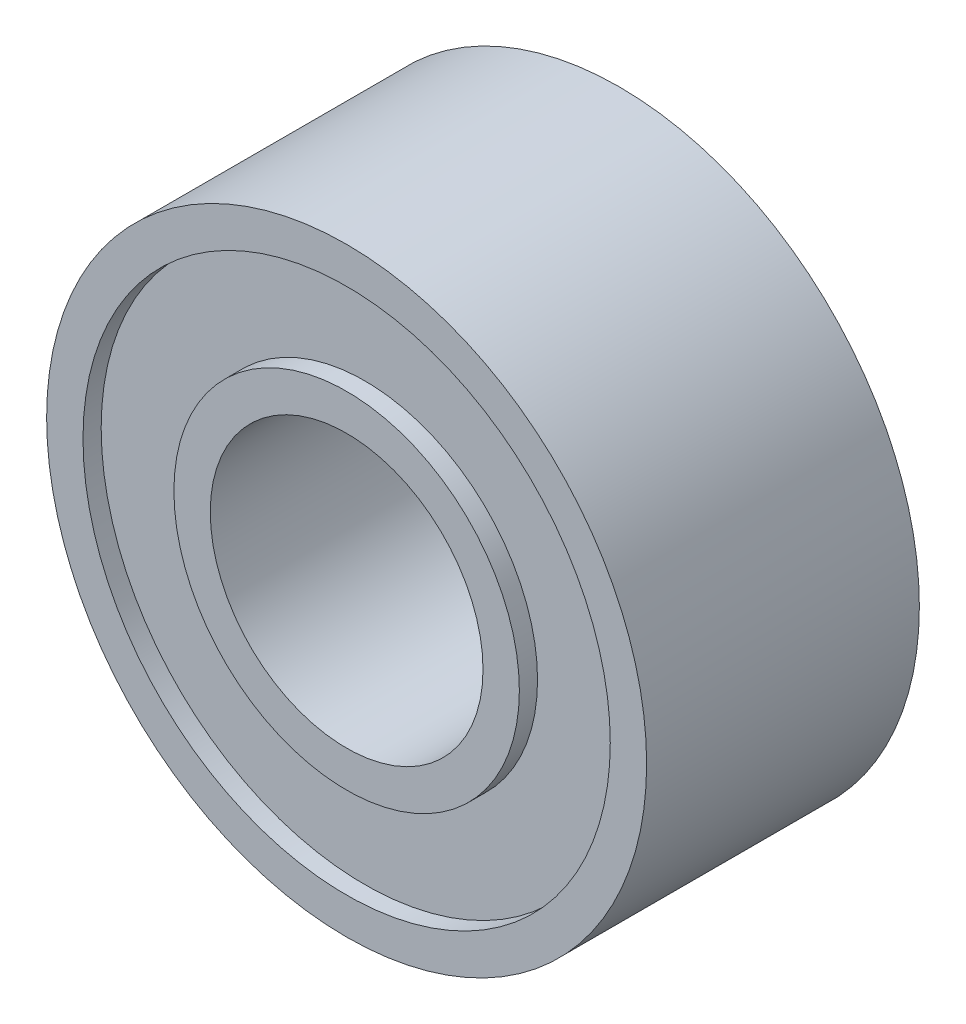
ISO-10303-21;
HEADER;
FILE_DESCRIPTION(('STEP AP214'),'2;1');
FILE_NAME('part.step','',(''),(''),'','','');
FILE_SCHEMA(('AUTOMOTIVE_DESIGN { 1 0 10303 214 1 1 1 1 }'));
ENDSEC;
DATA;
#1=APPLICATION_CONTEXT('core data for automotive mechanical design processes');
#2=APPLICATION_PROTOCOL_DEFINITION('international standard','automotive_design',2000,#1);
#3=PRODUCT_CONTEXT('',#1,'mechanical');
#4=PRODUCT('Part','Part','',(#3));
#5=PRODUCT_RELATED_PRODUCT_CATEGORY('part','',(#4));
#6=PRODUCT_DEFINITION_FORMATION('','',#4);
#7=PRODUCT_DEFINITION_CONTEXT('part definition',#1,'design');
#8=PRODUCT_DEFINITION('design','',#6,#7);
#9=PRODUCT_DEFINITION_SHAPE('','',#8);
#10=(LENGTH_UNIT() NAMED_UNIT(*) SI_UNIT(.MILLI.,.METRE.));
#11=(NAMED_UNIT(*) PLANE_ANGLE_UNIT() SI_UNIT($,.RADIAN.));
#12=(NAMED_UNIT(*) SI_UNIT($,.STERADIAN.) SOLID_ANGLE_UNIT());
#13=UNCERTAINTY_MEASURE_WITH_UNIT(LENGTH_MEASURE(1.E-05),#10,'distance_accuracy_value','');
#14=(GEOMETRIC_REPRESENTATION_CONTEXT(3) GLOBAL_UNCERTAINTY_ASSIGNED_CONTEXT((#13)) GLOBAL_UNIT_ASSIGNED_CONTEXT((#10,
#11,#12)) REPRESENTATION_CONTEXT('',''));
#15=CARTESIAN_POINT('',(0.,0.,0.));
#16=DIRECTION('',(0.,0.,1.));
#17=DIRECTION('',(1.,0.,0.));
#18=AXIS2_PLACEMENT_3D('',#15,#16,#17);
#19=CARTESIAN_POINT('',(0.,0.,7.5));
#20=DIRECTION('',(0.,0.,-1.));
#21=DIRECTION('',(-1.,0.,0.));
#22=AXIS2_PLACEMENT_3D('',#19,#20,#21);
#23=CYLINDRICAL_SURFACE('',#22,9.5);
#24=CARTESIAN_POINT('',(0.,0.,-7.5));
#25=DIRECTION('',(0.,0.,1.));
#26=DIRECTION('',(1.,0.,0.));
#27=AXIS2_PLACEMENT_3D('',#24,#25,#26);
#28=CIRCLE('',#27,9.5);
#29=CARTESIAN_POINT('',(9.5,0.,-7.5));
#30=VERTEX_POINT('',#29);
#31=EDGE_CURVE('E53',#30,#30,#28,.T.);
#32=ORIENTED_EDGE('',*,*,#31,.T.);
#33=EDGE_LOOP('',(#32));
#34=FACE_BOUND('',#33,.T.);
#35=CARTESIAN_POINT('',(0.,0.,-6.5));
#36=DIRECTION('',(0.,0.,1.));
#37=DIRECTION('',(1.,0.,0.));
#38=AXIS2_PLACEMENT_3D('',#35,#36,#37);
#39=CIRCLE('',#38,9.5);
#40=CARTESIAN_POINT('',(9.5,0.,-6.5));
#41=VERTEX_POINT('',#40);
#42=EDGE_CURVE('E10',#41,#41,#39,.T.);
#43=ORIENTED_EDGE('',*,*,#42,.F.);
#44=EDGE_LOOP('',(#43));
#45=FACE_BOUND('',#44,.T.);
#46=ADVANCED_FACE('F42',(#34,#45),#23,.T.);
#47=CARTESIAN_POINT('',(0.,0.,7.5));
#48=DIRECTION('',(0.,0.,1.));
#49=DIRECTION('',(1.,0.,0.));
#50=AXIS2_PLACEMENT_3D('',#47,#48,#49);
#51=PLANE('',#50);
#52=CARTESIAN_POINT('',(0.,0.,7.5));
#53=DIRECTION('',(0.,0.,1.));
#54=DIRECTION('',(1.,0.,0.));
#55=AXIS2_PLACEMENT_3D('',#52,#53,#54);
#56=CIRCLE('',#55,9.5);
#57=CARTESIAN_POINT('',(9.5,0.,7.5));
#58=VERTEX_POINT('',#57);
#59=EDGE_CURVE('E49',#58,#58,#56,.T.);
#60=ORIENTED_EDGE('',*,*,#59,.T.);
#61=EDGE_LOOP('',(#60));
#62=FACE_BOUND('',#61,.T.);
#63=CARTESIAN_POINT('',(0.,0.,7.5));
#64=DIRECTION('',(0.,0.,1.));
#65=DIRECTION('',(1.,0.,0.));
#66=AXIS2_PLACEMENT_3D('',#63,#64,#65);
#67=CIRCLE('',#66,7.5);
#68=CARTESIAN_POINT('',(7.5,0.,7.5));
#69=VERTEX_POINT('',#68);
#70=EDGE_CURVE('E58',#69,#69,#67,.T.);
#71=ORIENTED_EDGE('',*,*,#70,.F.);
#72=EDGE_LOOP('',(#71));
#73=FACE_BOUND('',#72,.T.);
#74=ADVANCED_FACE('F106',(#62,#73),#51,.T.);
#75=CARTESIAN_POINT('',(0.,0.,-7.5));
#76=DIRECTION('',(0.,0.,1.));
#77=DIRECTION('',(1.,0.,0.));
#78=AXIS2_PLACEMENT_3D('',#75,#76,#77);
#79=PLANE('',#78);
#80=ORIENTED_EDGE('',*,*,#31,.F.);
#81=EDGE_LOOP('',(#80));
#82=FACE_BOUND('',#81,.T.);
#83=CARTESIAN_POINT('',(0.,0.,-7.5));
#84=DIRECTION('',(0.,0.,1.));
#85=DIRECTION('',(1.,0.,0.));
#86=AXIS2_PLACEMENT_3D('',#83,#84,#85);
#87=CIRCLE('',#86,7.5);
#88=CARTESIAN_POINT('',(7.5,0.,-7.5));
#89=VERTEX_POINT('',#88);
#90=EDGE_CURVE('E60',#89,#89,#87,.T.);
#91=ORIENTED_EDGE('',*,*,#90,.T.);
#92=EDGE_LOOP('',(#91));
#93=FACE_BOUND('',#92,.T.);
#94=ADVANCED_FACE('F111',(#82,#93),#79,.F.);
#95=CARTESIAN_POINT('',(0.,0.,6.5));
#96=DIRECTION('',(0.,0.,1.));
#97=DIRECTION('',(1.,0.,0.));
#98=AXIS2_PLACEMENT_3D('',#95,#96,#97);
#99=CIRCLE('',#98,9.5);
#100=CARTESIAN_POINT('',(9.5,0.,6.5));
#101=VERTEX_POINT('',#100);
#102=EDGE_CURVE('E68',#101,#101,#99,.T.);
#103=ORIENTED_EDGE('',*,*,#102,.T.);
#104=EDGE_LOOP('',(#103));
#105=FACE_BOUND('',#104,.T.);
#106=ORIENTED_EDGE('',*,*,#59,.F.);
#107=EDGE_LOOP('',(#106));
#108=FACE_BOUND('',#107,.T.);
#109=ADVANCED_FACE('F44',(#105,#108),#23,.T.);
#110=CARTESIAN_POINT('',(0.,0.,7.5));
#111=DIRECTION('',(0.,0.,-1.));
#112=DIRECTION('',(-1.,0.,0.));
#113=AXIS2_PLACEMENT_3D('',#110,#111,#112);
#114=CYLINDRICAL_SURFACE('',#113,7.5);
#115=ORIENTED_EDGE('',*,*,#70,.T.);
#116=EDGE_LOOP('',(#115));
#117=FACE_BOUND('',#116,.T.);
#118=ORIENTED_EDGE('',*,*,#90,.F.);
#119=EDGE_LOOP('',(#118));
#120=FACE_BOUND('',#119,.T.);
#121=ADVANCED_FACE('F115',(#117,#120),#114,.F.);
#122=CARTESIAN_POINT('',(0.,0.,6.5));
#123=DIRECTION('',(0.,0.,1.));
#124=DIRECTION('',(1.,0.,0.));
#125=AXIS2_PLACEMENT_3D('',#122,#123,#124);
#126=PLANE('',#125);
#127=CARTESIAN_POINT('',(0.,0.,6.5));
#128=DIRECTION('',(0.,0.,1.));
#129=DIRECTION('',(1.,0.,0.));
#130=AXIS2_PLACEMENT_3D('',#127,#128,#129);
#131=CIRCLE('',#130,14.5);
#132=CARTESIAN_POINT('',(14.5,0.,6.5));
#133=VERTEX_POINT('',#132);
#134=EDGE_CURVE('E71',#133,#133,#131,.F.);
#135=ORIENTED_EDGE('',*,*,#134,.F.);
#136=EDGE_LOOP('',(#135));
#137=FACE_BOUND('',#136,.T.);
#138=ORIENTED_EDGE('',*,*,#102,.F.);
#139=EDGE_LOOP('',(#138));
#140=FACE_BOUND('',#139,.T.);
#141=ADVANCED_FACE('F121',(#137,#140),#126,.T.);
#142=CARTESIAN_POINT('',(0.,0.,-6.5));
#143=DIRECTION('',(0.,0.,1.));
#144=DIRECTION('',(1.,0.,0.));
#145=AXIS2_PLACEMENT_3D('',#142,#143,#144);
#146=PLANE('',#145);
#147=CARTESIAN_POINT('',(0.,0.,-6.5));
#148=DIRECTION('',(0.,0.,1.));
#149=DIRECTION('',(1.,0.,0.));
#150=AXIS2_PLACEMENT_3D('',#147,#148,#149);
#151=CIRCLE('',#150,14.5);
#152=CARTESIAN_POINT('',(14.5,0.,-6.5));
#153=VERTEX_POINT('',#152);
#154=EDGE_CURVE('E63',#153,#153,#151,.T.);
#155=ORIENTED_EDGE('',*,*,#154,.F.);
#156=EDGE_LOOP('',(#155));
#157=FACE_BOUND('',#156,.T.);
#158=ORIENTED_EDGE('',*,*,#42,.T.);
#159=EDGE_LOOP('',(#158));
#160=FACE_BOUND('',#159,.T.);
#161=ADVANCED_FACE('F102',(#157,#160),#146,.F.);
#162=CARTESIAN_POINT('',(0.,0.,7.5));
#163=DIRECTION('',(0.,0.,-1.));
#164=DIRECTION('',(-1.,0.,0.));
#165=AXIS2_PLACEMENT_3D('',#162,#163,#164);
#166=CYLINDRICAL_SURFACE('',#165,14.5);
#167=CARTESIAN_POINT('',(0.,0.,-7.5));
#168=DIRECTION('',(0.,0.,1.));
#169=DIRECTION('',(1.,0.,0.));
#170=AXIS2_PLACEMENT_3D('',#167,#168,#169);
#171=CIRCLE('',#170,14.5);
#172=CARTESIAN_POINT('',(14.5,0.,-7.5));
#173=VERTEX_POINT('',#172);
#174=EDGE_CURVE('E81',#173,#173,#171,.T.);
#175=ORIENTED_EDGE('',*,*,#174,.F.);
#176=EDGE_LOOP('',(#175));
#177=FACE_BOUND('',#176,.T.);
#178=ORIENTED_EDGE('',*,*,#154,.T.);
#179=EDGE_LOOP('',(#178));
#180=FACE_BOUND('',#179,.T.);
#181=ADVANCED_FACE('F92',(#177,#180),#166,.F.);
#182=CARTESIAN_POINT('',(0.,0.,7.5));
#183=DIRECTION('',(0.,0.,1.));
#184=DIRECTION('',(1.,0.,0.));
#185=AXIS2_PLACEMENT_3D('',#182,#183,#184);
#186=PLANE('',#185);
#187=CARTESIAN_POINT('',(0.,0.,7.5));
#188=DIRECTION('',(0.,0.,1.));
#189=DIRECTION('',(1.,0.,0.));
#190=AXIS2_PLACEMENT_3D('',#187,#188,#189);
#191=CIRCLE('',#190,16.5);
#192=CARTESIAN_POINT('',(16.5,0.,7.5));
#193=VERTEX_POINT('',#192);
#194=EDGE_CURVE('E74',#193,#193,#191,.T.);
#195=ORIENTED_EDGE('',*,*,#194,.T.);
#196=EDGE_LOOP('',(#195));
#197=FACE_BOUND('',#196,.T.);
#198=CARTESIAN_POINT('',(0.,0.,7.5));
#199=DIRECTION('',(0.,0.,1.));
#200=DIRECTION('',(1.,0.,0.));
#201=AXIS2_PLACEMENT_3D('',#198,#199,#200);
#202=CIRCLE('',#201,14.5);
#203=CARTESIAN_POINT('',(14.5,0.,7.5));
#204=VERTEX_POINT('',#203);
#205=EDGE_CURVE('E78',#204,#204,#202,.T.);
#206=ORIENTED_EDGE('',*,*,#205,.F.);
#207=EDGE_LOOP('',(#206));
#208=FACE_BOUND('',#207,.T.);
#209=ADVANCED_FACE('F89',(#197,#208),#186,.T.);
#210=CARTESIAN_POINT('',(0.,0.,-7.5));
#211=DIRECTION('',(0.,0.,1.));
#212=DIRECTION('',(1.,0.,0.));
#213=AXIS2_PLACEMENT_3D('',#210,#211,#212);
#214=PLANE('',#213);
#215=CARTESIAN_POINT('',(0.,0.,-7.5));
#216=DIRECTION('',(0.,0.,1.));
#217=DIRECTION('',(1.,0.,0.));
#218=AXIS2_PLACEMENT_3D('',#215,#216,#217);
#219=CIRCLE('',#218,16.5);
#220=CARTESIAN_POINT('',(16.5,0.,-7.5));
#221=VERTEX_POINT('',#220);
#222=EDGE_CURVE('E75',#221,#221,#219,.T.);
#223=ORIENTED_EDGE('',*,*,#222,.F.);
#224=EDGE_LOOP('',(#223));
#225=FACE_BOUND('',#224,.T.);
#226=ORIENTED_EDGE('',*,*,#174,.T.);
#227=EDGE_LOOP('',(#226));
#228=FACE_BOUND('',#227,.T.);
#229=ADVANCED_FACE('F91',(#225,#228),#214,.F.);
#230=CARTESIAN_POINT('',(0.,0.,7.5));
#231=DIRECTION('',(0.,0.,-1.));
#232=DIRECTION('',(-1.,0.,0.));
#233=AXIS2_PLACEMENT_3D('',#230,#231,#232);
#234=CYLINDRICAL_SURFACE('',#233,16.5);
#235=ORIENTED_EDGE('',*,*,#194,.F.);
#236=EDGE_LOOP('',(#235));
#237=FACE_BOUND('',#236,.T.);
#238=ORIENTED_EDGE('',*,*,#222,.T.);
#239=EDGE_LOOP('',(#238));
#240=FACE_BOUND('',#239,.T.);
#241=ADVANCED_FACE('F99',(#237,#240),#234,.T.);
#242=ORIENTED_EDGE('',*,*,#134,.T.);
#243=EDGE_LOOP('',(#242));
#244=FACE_BOUND('',#243,.T.);
#245=ORIENTED_EDGE('',*,*,#205,.T.);
#246=EDGE_LOOP('',(#245));
#247=FACE_BOUND('',#246,.T.);
#248=ADVANCED_FACE('F87',(#244,#247),#166,.F.);
#249=CLOSED_SHELL('',(#46,#74,#94,#109,#121,#141,#161,#181,#209,#229,#241,#248));
#250=MANIFOLD_SOLID_BREP('B2',#249);
#251=ADVANCED_BREP_SHAPE_REPRESENTATION('',(#18,#250),#14);
#252=SHAPE_DEFINITION_REPRESENTATION(#9,#251);
ENDSEC;
END-ISO-10303-21;
